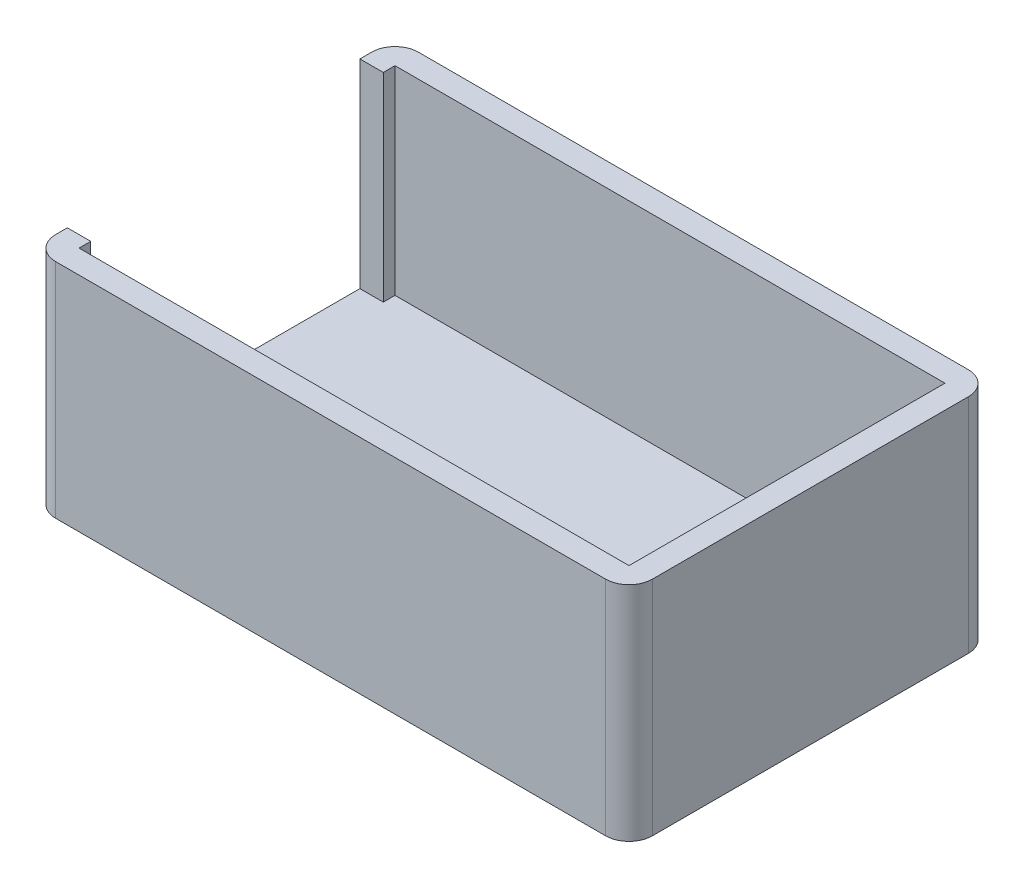
ISO-10303-21;
HEADER;
FILE_DESCRIPTION(('STEP AP214'),'2;1');
FILE_NAME('part.step','',(''),(''),'','','');
FILE_SCHEMA(('AUTOMOTIVE_DESIGN { 1 0 10303 214 1 1 1 1 }'));
ENDSEC;
DATA;
#1=APPLICATION_CONTEXT('core data for automotive mechanical design processes');
#2=APPLICATION_PROTOCOL_DEFINITION('international standard','automotive_design',2000,#1);
#3=PRODUCT_CONTEXT('',#1,'mechanical');
#4=PRODUCT('Part','Part','',(#3));
#5=PRODUCT_RELATED_PRODUCT_CATEGORY('part','',(#4));
#6=PRODUCT_DEFINITION_FORMATION('','',#4);
#7=PRODUCT_DEFINITION_CONTEXT('part definition',#1,'design');
#8=PRODUCT_DEFINITION('design','',#6,#7);
#9=PRODUCT_DEFINITION_SHAPE('','',#8);
#10=(LENGTH_UNIT() NAMED_UNIT(*) SI_UNIT(.MILLI.,.METRE.));
#11=(NAMED_UNIT(*) PLANE_ANGLE_UNIT() SI_UNIT($,.RADIAN.));
#12=(NAMED_UNIT(*) SI_UNIT($,.STERADIAN.) SOLID_ANGLE_UNIT());
#13=UNCERTAINTY_MEASURE_WITH_UNIT(LENGTH_MEASURE(1.E-05),#10,'distance_accuracy_value','');
#14=(GEOMETRIC_REPRESENTATION_CONTEXT(3) GLOBAL_UNCERTAINTY_ASSIGNED_CONTEXT((#13)) GLOBAL_UNIT_ASSIGNED_CONTEXT((#10,
#11,#12)) REPRESENTATION_CONTEXT('',''));
#15=CARTESIAN_POINT('',(0.,0.,0.));
#16=DIRECTION('',(0.,0.,1.));
#17=DIRECTION('',(1.,0.,0.));
#18=AXIS2_PLACEMENT_3D('',#15,#16,#17);
#19=CARTESIAN_POINT('',(2.,2.,-29.));
#20=DIRECTION('',(0.,-1.,0.));
#21=DIRECTION('',(0.,0.,-1.));
#22=AXIS2_PLACEMENT_3D('',#19,#20,#21);
#23=CYLINDRICAL_SURFACE('',#22,2.);
#24=DIRECTION('',(0.,-1.,0.));
#25=VECTOR('',#24,1.);
#26=CARTESIAN_POINT('',(0.,2.,-29.));
#27=LINE('',#26,#25);
#28=CARTESIAN_POINT('',(0.,19.,-29.));
#29=VERTEX_POINT('',#28);
#30=CARTESIAN_POINT('',(0.,0.,-29.));
#31=VERTEX_POINT('',#30);
#32=EDGE_CURVE('E390',#29,#31,#27,.T.);
#33=ORIENTED_EDGE('',*,*,#32,.F.);
#34=CARTESIAN_POINT('',(2.,19.,-29.));
#35=DIRECTION('',(0.,1.,0.));
#36=DIRECTION('',(0.,0.,1.));
#37=AXIS2_PLACEMENT_3D('',#34,#35,#36);
#38=CIRCLE('',#37,2.);
#39=CARTESIAN_POINT('',(2.,19.,-31.));
#40=VERTEX_POINT('',#39);
#41=EDGE_CURVE('E121',#40,#29,#38,.T.);
#42=ORIENTED_EDGE('',*,*,#41,.F.);
#43=DIRECTION('',(0.,-1.,0.));
#44=VECTOR('',#43,1.);
#45=CARTESIAN_POINT('',(2.,2.,-31.));
#46=LINE('',#45,#44);
#47=CARTESIAN_POINT('',(2.,0.,-31.));
#48=VERTEX_POINT('',#47);
#49=EDGE_CURVE('E394',#48,#40,#46,.F.);
#50=ORIENTED_EDGE('',*,*,#49,.F.);
#51=CARTESIAN_POINT('',(2.,0.,-29.));
#52=DIRECTION('',(0.,-1.,0.));
#53=DIRECTION('',(0.,0.,-1.));
#54=AXIS2_PLACEMENT_3D('',#51,#52,#53);
#55=CIRCLE('',#54,2.);
#56=EDGE_CURVE('E12',#31,#48,#55,.T.);
#57=ORIENTED_EDGE('',*,*,#56,.F.);
#58=EDGE_LOOP('',(#33,#42,#50,#57));
#59=FACE_BOUND('',#58,.T.);
#60=ADVANCED_FACE('F113',(#59),#23,.T.);
#61=CARTESIAN_POINT('',(2.,2.,-2.));
#62=DIRECTION('',(0.,1.,0.));
#63=DIRECTION('',(0.,0.,1.));
#64=AXIS2_PLACEMENT_3D('',#61,#62,#63);
#65=CYLINDRICAL_SURFACE('',#64,2.);
#66=DIRECTION('',(0.,1.,0.));
#67=VECTOR('',#66,1.);
#68=CARTESIAN_POINT('',(0.,2.,-2.));
#69=LINE('',#68,#67);
#70=CARTESIAN_POINT('',(0.,0.,-2.));
#71=VERTEX_POINT('',#70);
#72=CARTESIAN_POINT('',(0.,19.,-2.));
#73=VERTEX_POINT('',#72);
#74=EDGE_CURVE('E375',#71,#73,#69,.T.);
#75=ORIENTED_EDGE('',*,*,#74,.F.);
#76=CARTESIAN_POINT('',(2.,0.,-2.));
#77=DIRECTION('',(0.,-1.,0.));
#78=DIRECTION('',(0.,0.,-1.));
#79=AXIS2_PLACEMENT_3D('',#76,#77,#78);
#80=CIRCLE('',#79,2.);
#81=CARTESIAN_POINT('',(2.,0.,0.));
#82=VERTEX_POINT('',#81);
#83=EDGE_CURVE('E383',#82,#71,#80,.T.);
#84=ORIENTED_EDGE('',*,*,#83,.F.);
#85=DIRECTION('',(0.,1.,0.));
#86=VECTOR('',#85,1.);
#87=CARTESIAN_POINT('',(2.,2.,0.));
#88=LINE('',#87,#86);
#89=CARTESIAN_POINT('',(2.,19.,0.));
#90=VERTEX_POINT('',#89);
#91=EDGE_CURVE('E379',#90,#82,#88,.F.);
#92=ORIENTED_EDGE('',*,*,#91,.F.);
#93=CARTESIAN_POINT('',(2.,19.,-2.));
#94=DIRECTION('',(0.,1.,0.));
#95=DIRECTION('',(0.,0.,1.));
#96=AXIS2_PLACEMENT_3D('',#93,#94,#95);
#97=CIRCLE('',#96,2.);
#98=EDGE_CURVE('E387',#73,#90,#97,.T.);
#99=ORIENTED_EDGE('',*,*,#98,.F.);
#100=EDGE_LOOP('',(#75,#84,#92,#99));
#101=FACE_BOUND('',#100,.T.);
#102=ADVANCED_FACE('F433',(#101),#65,.T.);
#103=CARTESIAN_POINT('',(49.,2.,-29.));
#104=DIRECTION('',(0.,-1.,0.));
#105=DIRECTION('',(0.,0.,-1.));
#106=AXIS2_PLACEMENT_3D('',#103,#104,#105);
#107=CYLINDRICAL_SURFACE('',#106,2.);
#108=DIRECTION('',(0.,-1.,0.));
#109=VECTOR('',#108,1.);
#110=CARTESIAN_POINT('',(49.,2.,-31.));
#111=LINE('',#110,#109);
#112=CARTESIAN_POINT('',(49.,19.,-31.));
#113=VERTEX_POINT('',#112);
#114=CARTESIAN_POINT('',(49.,0.,-31.));
#115=VERTEX_POINT('',#114);
#116=EDGE_CURVE('E361',#113,#115,#111,.T.);
#117=ORIENTED_EDGE('',*,*,#116,.F.);
#118=CARTESIAN_POINT('',(49.,19.,-29.));
#119=DIRECTION('',(0.,1.,0.));
#120=DIRECTION('',(0.,0.,1.));
#121=AXIS2_PLACEMENT_3D('',#118,#119,#120);
#122=CIRCLE('',#121,2.);
#123=CARTESIAN_POINT('',(51.,19.,-29.));
#124=VERTEX_POINT('',#123);
#125=EDGE_CURVE('E369',#124,#113,#122,.T.);
#126=ORIENTED_EDGE('',*,*,#125,.F.);
#127=DIRECTION('',(0.,-1.,0.));
#128=VECTOR('',#127,1.);
#129=CARTESIAN_POINT('',(51.,2.,-29.));
#130=LINE('',#129,#128);
#131=CARTESIAN_POINT('',(51.,0.,-29.));
#132=VERTEX_POINT('',#131);
#133=EDGE_CURVE('E365',#132,#124,#130,.F.);
#134=ORIENTED_EDGE('',*,*,#133,.F.);
#135=CARTESIAN_POINT('',(49.,0.,-29.));
#136=DIRECTION('',(0.,-1.,0.));
#137=DIRECTION('',(0.,0.,-1.));
#138=AXIS2_PLACEMENT_3D('',#135,#136,#137);
#139=CIRCLE('',#138,2.);
#140=EDGE_CURVE('E372',#115,#132,#139,.T.);
#141=ORIENTED_EDGE('',*,*,#140,.F.);
#142=EDGE_LOOP('',(#117,#126,#134,#141));
#143=FACE_BOUND('',#142,.T.);
#144=ADVANCED_FACE('F448',(#143),#107,.T.);
#145=CARTESIAN_POINT('',(49.,2.,-2.));
#146=DIRECTION('',(0.,1.,0.));
#147=DIRECTION('',(0.,0.,1.));
#148=AXIS2_PLACEMENT_3D('',#145,#146,#147);
#149=CYLINDRICAL_SURFACE('',#148,2.);
#150=DIRECTION('',(0.,1.,0.));
#151=VECTOR('',#150,1.);
#152=CARTESIAN_POINT('',(49.,2.,0.));
#153=LINE('',#152,#151);
#154=CARTESIAN_POINT('',(49.,0.,0.));
#155=VERTEX_POINT('',#154);
#156=CARTESIAN_POINT('',(49.,19.,0.));
#157=VERTEX_POINT('',#156);
#158=EDGE_CURVE('E333',#155,#157,#153,.T.);
#159=ORIENTED_EDGE('',*,*,#158,.F.);
#160=CARTESIAN_POINT('',(49.,0.,-2.));
#161=DIRECTION('',(0.,-1.,0.));
#162=DIRECTION('',(0.,0.,-1.));
#163=AXIS2_PLACEMENT_3D('',#160,#161,#162);
#164=CIRCLE('',#163,2.);
#165=CARTESIAN_POINT('',(51.,0.,-2.));
#166=VERTEX_POINT('',#165);
#167=EDGE_CURVE('E354',#166,#155,#164,.T.);
#168=ORIENTED_EDGE('',*,*,#167,.F.);
#169=DIRECTION('',(0.,1.,0.));
#170=VECTOR('',#169,1.);
#171=CARTESIAN_POINT('',(51.,2.,-2.));
#172=LINE('',#171,#170);
#173=CARTESIAN_POINT('',(51.,19.,-2.));
#174=VERTEX_POINT('',#173);
#175=EDGE_CURVE('E350',#174,#166,#172,.F.);
#176=ORIENTED_EDGE('',*,*,#175,.F.);
#177=CARTESIAN_POINT('',(49.,19.,-2.));
#178=DIRECTION('',(0.,1.,0.));
#179=DIRECTION('',(0.,0.,1.));
#180=AXIS2_PLACEMENT_3D('',#177,#178,#179);
#181=CIRCLE('',#180,2.);
#182=EDGE_CURVE('E358',#157,#174,#181,.T.);
#183=ORIENTED_EDGE('',*,*,#182,.F.);
#184=EDGE_LOOP('',(#159,#168,#176,#183));
#185=FACE_BOUND('',#184,.T.);
#186=ADVANCED_FACE('F439',(#185),#149,.T.);
#187=CARTESIAN_POINT('',(0.,2.,0.));
#188=DIRECTION('',(1.,0.,0.));
#189=DIRECTION('',(0.,0.,-1.));
#190=AXIS2_PLACEMENT_3D('',#187,#188,#189);
#191=PLANE('',#190);
#192=DIRECTION('',(0.,0.,1.));
#193=VECTOR('',#192,1.);
#194=CARTESIAN_POINT('',(0.,19.,0.));
#195=LINE('',#194,#193);
#196=CARTESIAN_POINT('',(0.,19.,-28.));
#197=VERTEX_POINT('',#196);
#198=EDGE_CURVE('E238',#29,#197,#195,.T.);
#199=ORIENTED_EDGE('',*,*,#198,.F.);
#200=ORIENTED_EDGE('',*,*,#32,.T.);
#201=DIRECTION('',(0.,0.,1.));
#202=VECTOR('',#201,1.);
#203=CARTESIAN_POINT('',(0.,0.,0.));
#204=LINE('',#203,#202);
#205=EDGE_CURVE('E305',#31,#71,#204,.T.);
#206=ORIENTED_EDGE('',*,*,#205,.T.);
#207=ORIENTED_EDGE('',*,*,#74,.T.);
#208=DIRECTION('',(0.,0.,1.));
#209=VECTOR('',#208,1.);
#210=CARTESIAN_POINT('',(0.,19.,0.));
#211=LINE('',#210,#209);
#212=CARTESIAN_POINT('',(0.,19.,-3.));
#213=VERTEX_POINT('',#212);
#214=EDGE_CURVE('E257',#213,#73,#211,.T.);
#215=ORIENTED_EDGE('',*,*,#214,.F.);
#216=DIRECTION('',(0.,-1.,0.));
#217=VECTOR('',#216,1.);
#218=CARTESIAN_POINT('',(0.,19.,-3.));
#219=LINE('',#218,#217);
#220=CARTESIAN_POINT('',(0.,2.,-3.));
#221=VERTEX_POINT('',#220);
#222=EDGE_CURVE('E297',#213,#221,#219,.T.);
#223=ORIENTED_EDGE('',*,*,#222,.T.);
#224=DIRECTION('',(0.,0.,1.));
#225=VECTOR('',#224,1.);
#226=CARTESIAN_POINT('',(0.,2.,0.));
#227=LINE('',#226,#225);
#228=CARTESIAN_POINT('',(0.,2.,-28.));
#229=VERTEX_POINT('',#228);
#230=EDGE_CURVE('E330',#229,#221,#227,.T.);
#231=ORIENTED_EDGE('',*,*,#230,.F.);
#232=DIRECTION('',(0.,-1.,0.));
#233=VECTOR('',#232,1.);
#234=CARTESIAN_POINT('',(0.,19.,-28.));
#235=LINE('',#234,#233);
#236=EDGE_CURVE('E292',#197,#229,#235,.T.);
#237=ORIENTED_EDGE('',*,*,#236,.F.);
#238=EDGE_LOOP('',(#199,#200,#206,#207,#215,#223,#231,#237));
#239=FACE_BOUND('',#238,.T.);
#240=ADVANCED_FACE('F401',(#239),#191,.F.);
#241=CARTESIAN_POINT('',(0.,2.,0.));
#242=DIRECTION('',(0.,0.,-1.));
#243=DIRECTION('',(-1.,0.,0.));
#244=AXIS2_PLACEMENT_3D('',#241,#242,#243);
#245=PLANE('',#244);
#246=DIRECTION('',(1.,0.,0.));
#247=VECTOR('',#246,1.);
#248=CARTESIAN_POINT('',(0.,19.,0.));
#249=LINE('',#248,#247);
#250=EDGE_CURVE('E264',#90,#157,#249,.T.);
#251=ORIENTED_EDGE('',*,*,#250,.F.);
#252=ORIENTED_EDGE('',*,*,#91,.T.);
#253=DIRECTION('',(1.,0.,0.));
#254=VECTOR('',#253,1.);
#255=CARTESIAN_POINT('',(0.,0.,0.));
#256=LINE('',#255,#254);
#257=EDGE_CURVE('E337',#82,#155,#256,.T.);
#258=ORIENTED_EDGE('',*,*,#257,.T.);
#259=ORIENTED_EDGE('',*,*,#158,.T.);
#260=EDGE_LOOP('',(#251,#252,#258,#259));
#261=FACE_BOUND('',#260,.T.);
#262=ADVANCED_FACE('F436',(#261),#245,.F.);
#263=CARTESIAN_POINT('',(51.,2.,0.));
#264=DIRECTION('',(-1.,0.,0.));
#265=DIRECTION('',(0.,0.,1.));
#266=AXIS2_PLACEMENT_3D('',#263,#264,#265);
#267=PLANE('',#266);
#268=DIRECTION('',(0.,0.,-1.));
#269=VECTOR('',#268,1.);
#270=CARTESIAN_POINT('',(51.,0.,0.));
#271=LINE('',#270,#269);
#272=EDGE_CURVE('E340',#166,#132,#271,.T.);
#273=ORIENTED_EDGE('',*,*,#272,.T.);
#274=ORIENTED_EDGE('',*,*,#133,.T.);
#275=DIRECTION('',(0.,0.,-1.));
#276=VECTOR('',#275,1.);
#277=CARTESIAN_POINT('',(51.,19.,0.));
#278=LINE('',#277,#276);
#279=EDGE_CURVE('E267',#174,#124,#278,.T.);
#280=ORIENTED_EDGE('',*,*,#279,.F.);
#281=ORIENTED_EDGE('',*,*,#175,.T.);
#282=EDGE_LOOP('',(#273,#274,#280,#281));
#283=FACE_BOUND('',#282,.T.);
#284=ADVANCED_FACE('F444',(#283),#267,.F.);
#285=CARTESIAN_POINT('',(0.,2.,-31.));
#286=DIRECTION('',(0.,0.,1.));
#287=DIRECTION('',(1.,0.,0.));
#288=AXIS2_PLACEMENT_3D('',#285,#286,#287);
#289=PLANE('',#288);
#290=DIRECTION('',(-1.,0.,0.));
#291=VECTOR('',#290,1.);
#292=CARTESIAN_POINT('',(0.,0.,-31.));
#293=LINE('',#292,#291);
#294=EDGE_CURVE('E334',#115,#48,#293,.T.);
#295=ORIENTED_EDGE('',*,*,#294,.T.);
#296=ORIENTED_EDGE('',*,*,#49,.T.);
#297=DIRECTION('',(-1.,0.,0.));
#298=VECTOR('',#297,1.);
#299=CARTESIAN_POINT('',(0.,19.,-31.));
#300=LINE('',#299,#298);
#301=EDGE_CURVE('E280',#113,#40,#300,.T.);
#302=ORIENTED_EDGE('',*,*,#301,.F.);
#303=ORIENTED_EDGE('',*,*,#116,.T.);
#304=EDGE_LOOP('',(#295,#296,#302,#303));
#305=FACE_BOUND('',#304,.T.);
#306=ADVANCED_FACE('F450',(#305),#289,.F.);
#307=CARTESIAN_POINT('',(0.,2.,0.));
#308=DIRECTION('',(0.,-1.,0.));
#309=DIRECTION('',(0.,0.,-1.));
#310=AXIS2_PLACEMENT_3D('',#307,#308,#309);
#311=PLANE('',#310);
#312=ORIENTED_EDGE('',*,*,#230,.T.);
#313=DIRECTION('',(1.,0.,0.));
#314=VECTOR('',#313,1.);
#315=CARTESIAN_POINT('',(0.,2.,-3.));
#316=LINE('',#315,#314);
#317=CARTESIAN_POINT('',(2.,2.,-3.));
#318=VERTEX_POINT('',#317);
#319=EDGE_CURVE('E318',#221,#318,#316,.T.);
#320=ORIENTED_EDGE('',*,*,#319,.T.);
#321=DIRECTION('',(0.,0.,-1.));
#322=VECTOR('',#321,1.);
#323=CARTESIAN_POINT('',(2.,2.,-2.));
#324=LINE('',#323,#322);
#325=CARTESIAN_POINT('',(2.,2.,-2.));
#326=VERTEX_POINT('',#325);
#327=EDGE_CURVE('E314',#326,#318,#324,.T.);
#328=ORIENTED_EDGE('',*,*,#327,.F.);
#329=DIRECTION('',(1.,0.,0.));
#330=VECTOR('',#329,1.);
#331=CARTESIAN_POINT('',(0.,2.,-2.));
#332=LINE('',#331,#330);
#333=CARTESIAN_POINT('',(49.,2.,-2.));
#334=VERTEX_POINT('',#333);
#335=EDGE_CURVE('E277',#326,#334,#332,.T.);
#336=ORIENTED_EDGE('',*,*,#335,.T.);
#337=DIRECTION('',(0.,0.,1.));
#338=VECTOR('',#337,1.);
#339=CARTESIAN_POINT('',(49.,2.,0.));
#340=LINE('',#339,#338);
#341=CARTESIAN_POINT('',(49.,2.,-29.));
#342=VERTEX_POINT('',#341);
#343=EDGE_CURVE('E273',#342,#334,#340,.T.);
#344=ORIENTED_EDGE('',*,*,#343,.F.);
#345=DIRECTION('',(1.,0.,0.));
#346=VECTOR('',#345,1.);
#347=CARTESIAN_POINT('',(0.,2.,-29.));
#348=LINE('',#347,#346);
#349=CARTESIAN_POINT('',(2.,2.,-29.));
#350=VERTEX_POINT('',#349);
#351=EDGE_CURVE('E244',#350,#342,#348,.T.);
#352=ORIENTED_EDGE('',*,*,#351,.F.);
#353=DIRECTION('',(0.,0.,1.));
#354=VECTOR('',#353,1.);
#355=CARTESIAN_POINT('',(2.,2.,-29.));
#356=LINE('',#355,#354);
#357=CARTESIAN_POINT('',(2.,2.,-28.));
#358=VERTEX_POINT('',#357);
#359=EDGE_CURVE('E289',#350,#358,#356,.T.);
#360=ORIENTED_EDGE('',*,*,#359,.T.);
#361=DIRECTION('',(1.,0.,0.));
#362=VECTOR('',#361,1.);
#363=CARTESIAN_POINT('',(0.,2.,-28.));
#364=LINE('',#363,#362);
#365=EDGE_CURVE('E293',#229,#358,#364,.T.);
#366=ORIENTED_EDGE('',*,*,#365,.F.);
#367=EDGE_LOOP('',(#312,#320,#328,#336,#344,#352,#360,#366));
#368=FACE_BOUND('',#367,.T.);
#369=ADVANCED_FACE('F414',(#368),#311,.F.);
#370=CARTESIAN_POINT('',(0.,0.,0.));
#371=DIRECTION('',(0.,-1.,0.));
#372=DIRECTION('',(0.,0.,-1.));
#373=AXIS2_PLACEMENT_3D('',#370,#371,#372);
#374=PLANE('',#373);
#375=ORIENTED_EDGE('',*,*,#205,.F.);
#376=ORIENTED_EDGE('',*,*,#56,.T.);
#377=ORIENTED_EDGE('',*,*,#294,.F.);
#378=ORIENTED_EDGE('',*,*,#140,.T.);
#379=ORIENTED_EDGE('',*,*,#272,.F.);
#380=ORIENTED_EDGE('',*,*,#167,.T.);
#381=ORIENTED_EDGE('',*,*,#257,.F.);
#382=ORIENTED_EDGE('',*,*,#83,.T.);
#383=EDGE_LOOP('',(#375,#376,#377,#378,#379,#380,#381,#382));
#384=FACE_BOUND('',#383,.T.);
#385=ADVANCED_FACE('F451',(#384),#374,.T.);
#386=CARTESIAN_POINT('',(0.,19.,-29.));
#387=DIRECTION('',(0.,0.,-1.));
#388=DIRECTION('',(-1.,0.,0.));
#389=AXIS2_PLACEMENT_3D('',#386,#387,#388);
#390=PLANE('',#389);
#391=DIRECTION('',(1.,0.,0.));
#392=VECTOR('',#391,1.);
#393=CARTESIAN_POINT('',(0.,19.,-29.));
#394=LINE('',#393,#392);
#395=CARTESIAN_POINT('',(2.,19.,-29.));
#396=VERTEX_POINT('',#395);
#397=CARTESIAN_POINT('',(49.,19.,-29.));
#398=VERTEX_POINT('',#397);
#399=EDGE_CURVE('E225',#396,#398,#394,.T.);
#400=ORIENTED_EDGE('',*,*,#399,.F.);
#401=DIRECTION('',(0.,-1.,0.));
#402=VECTOR('',#401,1.);
#403=CARTESIAN_POINT('',(2.,19.,-29.));
#404=LINE('',#403,#402);
#405=EDGE_CURVE('E285',#396,#350,#404,.T.);
#406=ORIENTED_EDGE('',*,*,#405,.T.);
#407=ORIENTED_EDGE('',*,*,#351,.T.);
#408=DIRECTION('',(0.,-1.,0.));
#409=VECTOR('',#408,1.);
#410=CARTESIAN_POINT('',(49.,19.,-29.));
#411=LINE('',#410,#409);
#412=EDGE_CURVE('E242',#398,#342,#411,.T.);
#413=ORIENTED_EDGE('',*,*,#412,.F.);
#414=EDGE_LOOP('',(#400,#406,#407,#413));
#415=FACE_BOUND('',#414,.T.);
#416=ADVANCED_FACE('F243',(#415),#390,.F.);
#417=CARTESIAN_POINT('',(49.,19.,0.));
#418=DIRECTION('',(1.,0.,0.));
#419=DIRECTION('',(0.,0.,-1.));
#420=AXIS2_PLACEMENT_3D('',#417,#418,#419);
#421=PLANE('',#420);
#422=ORIENTED_EDGE('',*,*,#343,.T.);
#423=DIRECTION('',(0.,-1.,0.));
#424=VECTOR('',#423,1.);
#425=CARTESIAN_POINT('',(49.,19.,-2.));
#426=LINE('',#425,#424);
#427=CARTESIAN_POINT('',(49.,19.,-2.));
#428=VERTEX_POINT('',#427);
#429=EDGE_CURVE('E249',#428,#334,#426,.T.);
#430=ORIENTED_EDGE('',*,*,#429,.F.);
#431=DIRECTION('',(0.,0.,1.));
#432=VECTOR('',#431,1.);
#433=CARTESIAN_POINT('',(49.,19.,0.));
#434=LINE('',#433,#432);
#435=EDGE_CURVE('E231',#398,#428,#434,.T.);
#436=ORIENTED_EDGE('',*,*,#435,.F.);
#437=ORIENTED_EDGE('',*,*,#412,.T.);
#438=EDGE_LOOP('',(#422,#430,#436,#437));
#439=FACE_BOUND('',#438,.T.);
#440=ADVANCED_FACE('F251',(#439),#421,.F.);
#441=CARTESIAN_POINT('',(0.,19.,-2.));
#442=DIRECTION('',(0.,0.,-1.));
#443=DIRECTION('',(-1.,0.,0.));
#444=AXIS2_PLACEMENT_3D('',#441,#442,#443);
#445=PLANE('',#444);
#446=ORIENTED_EDGE('',*,*,#335,.F.);
#447=DIRECTION('',(0.,1.,0.));
#448=VECTOR('',#447,1.);
#449=CARTESIAN_POINT('',(2.,19.,-2.));
#450=LINE('',#449,#448);
#451=CARTESIAN_POINT('',(2.,19.,-2.));
#452=VERTEX_POINT('',#451);
#453=EDGE_CURVE('E248',#326,#452,#450,.T.);
#454=ORIENTED_EDGE('',*,*,#453,.T.);
#455=DIRECTION('',(1.,0.,0.));
#456=VECTOR('',#455,1.);
#457=CARTESIAN_POINT('',(0.,19.,-2.));
#458=LINE('',#457,#456);
#459=EDGE_CURVE('E254',#452,#428,#458,.T.);
#460=ORIENTED_EDGE('',*,*,#459,.T.);
#461=ORIENTED_EDGE('',*,*,#429,.T.);
#462=EDGE_LOOP('',(#446,#454,#460,#461));
#463=FACE_BOUND('',#462,.T.);
#464=ADVANCED_FACE('F418',(#463),#445,.T.);
#465=CARTESIAN_POINT('',(0.,19.,0.));
#466=DIRECTION('',(0.,1.,0.));
#467=DIRECTION('',(0.,0.,1.));
#468=AXIS2_PLACEMENT_3D('',#465,#466,#467);
#469=PLANE('',#468);
#470=ORIENTED_EDGE('',*,*,#301,.T.);
#471=ORIENTED_EDGE('',*,*,#41,.T.);
#472=ORIENTED_EDGE('',*,*,#198,.T.);
#473=DIRECTION('',(1.,0.,0.));
#474=VECTOR('',#473,1.);
#475=CARTESIAN_POINT('',(0.,19.,-28.));
#476=LINE('',#475,#474);
#477=CARTESIAN_POINT('',(2.,19.,-28.));
#478=VERTEX_POINT('',#477);
#479=EDGE_CURVE('E286',#197,#478,#476,.T.);
#480=ORIENTED_EDGE('',*,*,#479,.T.);
#481=DIRECTION('',(0.,0.,1.));
#482=VECTOR('',#481,1.);
#483=CARTESIAN_POINT('',(2.,19.,-29.));
#484=LINE('',#483,#482);
#485=EDGE_CURVE('E234',#396,#478,#484,.T.);
#486=ORIENTED_EDGE('',*,*,#485,.F.);
#487=ORIENTED_EDGE('',*,*,#399,.T.);
#488=ORIENTED_EDGE('',*,*,#435,.T.);
#489=ORIENTED_EDGE('',*,*,#459,.F.);
#490=DIRECTION('',(0.,0.,-1.));
#491=VECTOR('',#490,1.);
#492=CARTESIAN_POINT('',(2.,19.,-2.));
#493=LINE('',#492,#491);
#494=CARTESIAN_POINT('',(2.,19.,-3.));
#495=VERTEX_POINT('',#494);
#496=EDGE_CURVE('E313',#452,#495,#493,.T.);
#497=ORIENTED_EDGE('',*,*,#496,.T.);
#498=DIRECTION('',(1.,0.,0.));
#499=VECTOR('',#498,1.);
#500=CARTESIAN_POINT('',(0.,19.,-3.));
#501=LINE('',#500,#499);
#502=EDGE_CURVE('E309',#213,#495,#501,.T.);
#503=ORIENTED_EDGE('',*,*,#502,.F.);
#504=ORIENTED_EDGE('',*,*,#214,.T.);
#505=ORIENTED_EDGE('',*,*,#98,.T.);
#506=ORIENTED_EDGE('',*,*,#250,.T.);
#507=ORIENTED_EDGE('',*,*,#182,.T.);
#508=ORIENTED_EDGE('',*,*,#279,.T.);
#509=ORIENTED_EDGE('',*,*,#125,.T.);
#510=EDGE_LOOP('',(#470,#471,#472,#480,#486,#487,#488,#489,#497,#503,#504,#505,#506,#507,#508,#509));
#511=FACE_BOUND('',#510,.T.);
#512=ADVANCED_FACE('F228',(#511),#469,.T.);
#513=CARTESIAN_POINT('',(2.,19.,-2.));
#514=DIRECTION('',(-1.,0.,0.));
#515=DIRECTION('',(0.,0.,1.));
#516=AXIS2_PLACEMENT_3D('',#513,#514,#515);
#517=PLANE('',#516);
#518=ORIENTED_EDGE('',*,*,#327,.T.);
#519=DIRECTION('',(0.,-1.,0.));
#520=VECTOR('',#519,1.);
#521=CARTESIAN_POINT('',(2.,19.,-3.));
#522=LINE('',#521,#520);
#523=EDGE_CURVE('E317',#495,#318,#522,.T.);
#524=ORIENTED_EDGE('',*,*,#523,.F.);
#525=ORIENTED_EDGE('',*,*,#496,.F.);
#526=ORIENTED_EDGE('',*,*,#453,.F.);
#527=EDGE_LOOP('',(#518,#524,#525,#526));
#528=FACE_BOUND('',#527,.T.);
#529=ADVANCED_FACE('F423',(#528),#517,.F.);
#530=CARTESIAN_POINT('',(0.,19.,-3.));
#531=DIRECTION('',(0.,0.,-1.));
#532=DIRECTION('',(-1.,0.,0.));
#533=AXIS2_PLACEMENT_3D('',#530,#531,#532);
#534=PLANE('',#533);
#535=ORIENTED_EDGE('',*,*,#319,.F.);
#536=ORIENTED_EDGE('',*,*,#222,.F.);
#537=ORIENTED_EDGE('',*,*,#502,.T.);
#538=ORIENTED_EDGE('',*,*,#523,.T.);
#539=EDGE_LOOP('',(#535,#536,#537,#538));
#540=FACE_BOUND('',#539,.T.);
#541=ADVANCED_FACE('F427',(#540),#534,.T.);
#542=CARTESIAN_POINT('',(2.,19.,-29.));
#543=DIRECTION('',(1.,0.,0.));
#544=DIRECTION('',(0.,0.,-1.));
#545=AXIS2_PLACEMENT_3D('',#542,#543,#544);
#546=PLANE('',#545);
#547=ORIENTED_EDGE('',*,*,#359,.F.);
#548=ORIENTED_EDGE('',*,*,#405,.F.);
#549=ORIENTED_EDGE('',*,*,#485,.T.);
#550=DIRECTION('',(0.,-1.,0.));
#551=VECTOR('',#550,1.);
#552=CARTESIAN_POINT('',(2.,19.,-28.));
#553=LINE('',#552,#551);
#554=EDGE_CURVE('E274',#478,#358,#553,.T.);
#555=ORIENTED_EDGE('',*,*,#554,.T.);
#556=EDGE_LOOP('',(#547,#548,#549,#555));
#557=FACE_BOUND('',#556,.T.);
#558=ADVANCED_FACE('F412',(#557),#546,.T.);
#559=CARTESIAN_POINT('',(0.,19.,-28.));
#560=DIRECTION('',(0.,0.,-1.));
#561=DIRECTION('',(-1.,0.,0.));
#562=AXIS2_PLACEMENT_3D('',#559,#560,#561);
#563=PLANE('',#562);
#564=ORIENTED_EDGE('',*,*,#365,.T.);
#565=ORIENTED_EDGE('',*,*,#554,.F.);
#566=ORIENTED_EDGE('',*,*,#479,.F.);
#567=ORIENTED_EDGE('',*,*,#236,.T.);
#568=EDGE_LOOP('',(#564,#565,#566,#567));
#569=FACE_BOUND('',#568,.T.);
#570=ADVANCED_FACE('F409',(#569),#563,.F.);
#571=CLOSED_SHELL('',(#60,#102,#144,#186,#240,#262,#284,#306,#369,#385,#416,#440,#464,#512,#529,
#541,#558,#570));
#572=MANIFOLD_SOLID_BREP('B2',#571);
#573=ADVANCED_BREP_SHAPE_REPRESENTATION('',(#18,#572),#14);
#574=SHAPE_DEFINITION_REPRESENTATION(#9,#573);
ENDSEC;
END-ISO-10303-21;
